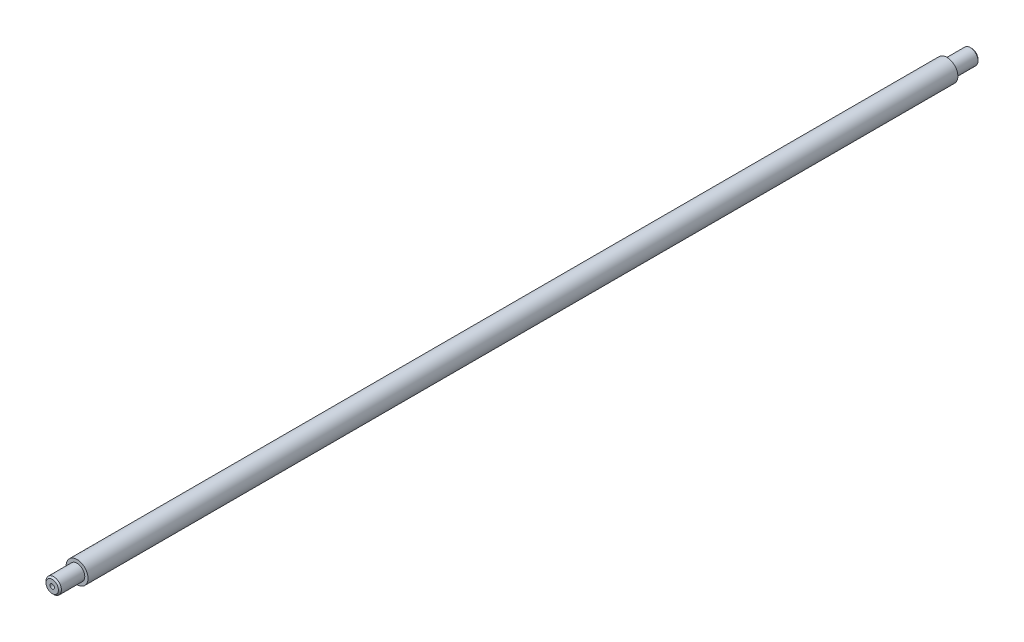
ISO-10303-21;
HEADER;
FILE_DESCRIPTION(('STEP AP214'),'2;1');
FILE_NAME('part.step','',(''),(''),'','','');
FILE_SCHEMA(('AUTOMOTIVE_DESIGN { 1 0 10303 214 1 1 1 1 }'));
ENDSEC;
DATA;
#1=APPLICATION_CONTEXT('core data for automotive mechanical design processes');
#2=APPLICATION_PROTOCOL_DEFINITION('international standard','automotive_design',2000,#1);
#3=PRODUCT_CONTEXT('',#1,'mechanical');
#4=PRODUCT('Part','Part','',(#3));
#5=PRODUCT_RELATED_PRODUCT_CATEGORY('part','',(#4));
#6=PRODUCT_DEFINITION_FORMATION('','',#4);
#7=PRODUCT_DEFINITION_CONTEXT('part definition',#1,'design');
#8=PRODUCT_DEFINITION('design','',#6,#7);
#9=PRODUCT_DEFINITION_SHAPE('','',#8);
#10=(LENGTH_UNIT() NAMED_UNIT(*) SI_UNIT(.MILLI.,.METRE.));
#11=(NAMED_UNIT(*) PLANE_ANGLE_UNIT() SI_UNIT($,.RADIAN.));
#12=(NAMED_UNIT(*) SI_UNIT($,.STERADIAN.) SOLID_ANGLE_UNIT());
#13=UNCERTAINTY_MEASURE_WITH_UNIT(LENGTH_MEASURE(1.E-05),#10,'distance_accuracy_value','');
#14=(GEOMETRIC_REPRESENTATION_CONTEXT(3) GLOBAL_UNCERTAINTY_ASSIGNED_CONTEXT((#13)) GLOBAL_UNIT_ASSIGNED_CONTEXT((#10,
#11,#12)) REPRESENTATION_CONTEXT('',''));
#15=CARTESIAN_POINT('',(0.,0.,0.));
#16=DIRECTION('',(0.,0.,1.));
#17=DIRECTION('',(1.,0.,0.));
#18=AXIS2_PLACEMENT_3D('',#15,#16,#17);
#19=CARTESIAN_POINT('',(0.,0.,222.25));
#20=DIRECTION('',(0.,0.,-1.));
#21=DIRECTION('',(-1.,0.,0.));
#22=AXIS2_PLACEMENT_3D('',#19,#20,#21);
#23=CYLINDRICAL_SURFACE('',#22,5.588);
#24=CARTESIAN_POINT('',(0.,0.,222.25));
#25=DIRECTION('',(0.,0.,1.));
#26=DIRECTION('',(1.,0.,0.));
#27=AXIS2_PLACEMENT_3D('',#24,#25,#26);
#28=CIRCLE('',#27,5.588);
#29=CARTESIAN_POINT('',(5.588,0.,222.25));
#30=VERTEX_POINT('',#29);
#31=EDGE_CURVE('E69',#30,#30,#28,.T.);
#32=ORIENTED_EDGE('',*,*,#31,.F.);
#33=EDGE_LOOP('',(#32));
#34=FACE_BOUND('',#33,.T.);
#35=CARTESIAN_POINT('',(0.,0.,-222.25));
#36=DIRECTION('',(0.,0.,1.));
#37=DIRECTION('',(1.,0.,0.));
#38=AXIS2_PLACEMENT_3D('',#35,#36,#37);
#39=CIRCLE('',#38,5.588);
#40=CARTESIAN_POINT('',(5.588,0.,-222.25));
#41=VERTEX_POINT('',#40);
#42=EDGE_CURVE('E65',#41,#41,#39,.T.);
#43=ORIENTED_EDGE('',*,*,#42,.T.);
#44=EDGE_LOOP('',(#43));
#45=FACE_BOUND('',#44,.T.);
#46=ADVANCED_FACE('F39',(#34,#45),#23,.T.);
#47=CARTESIAN_POINT('',(0.,0.,222.25));
#48=DIRECTION('',(0.,0.,1.));
#49=DIRECTION('',(1.,0.,0.));
#50=AXIS2_PLACEMENT_3D('',#47,#48,#49);
#51=PLANE('',#50);
#52=CARTESIAN_POINT('',(0.,0.,222.25));
#53=DIRECTION('',(0.,0.,1.));
#54=DIRECTION('',(1.,0.,0.));
#55=AXIS2_PLACEMENT_3D('',#52,#53,#54);
#56=CIRCLE('',#55,3.937);
#57=CARTESIAN_POINT('',(3.937,0.,222.25));
#58=VERTEX_POINT('',#57);
#59=EDGE_CURVE('E74',#58,#58,#56,.T.);
#60=ORIENTED_EDGE('',*,*,#59,.F.);
#61=EDGE_LOOP('',(#60));
#62=FACE_BOUND('',#61,.T.);
#63=ORIENTED_EDGE('',*,*,#31,.T.);
#64=EDGE_LOOP('',(#63));
#65=FACE_BOUND('',#64,.T.);
#66=ADVANCED_FACE('F122',(#62,#65),#51,.T.);
#67=CARTESIAN_POINT('',(0.,0.,-222.25));
#68=DIRECTION('',(0.,0.,1.));
#69=DIRECTION('',(1.,0.,0.));
#70=AXIS2_PLACEMENT_3D('',#67,#68,#69);
#71=PLANE('',#70);
#72=CARTESIAN_POINT('',(0.,0.,-222.25));
#73=DIRECTION('',(0.,0.,-1.));
#74=DIRECTION('',(-1.,0.,0.));
#75=AXIS2_PLACEMENT_3D('',#72,#73,#74);
#76=CIRCLE('',#75,3.937);
#77=CARTESIAN_POINT('',(-3.937,0.,-222.25));
#78=VERTEX_POINT('',#77);
#79=EDGE_CURVE('E64',#78,#78,#76,.T.);
#80=ORIENTED_EDGE('',*,*,#79,.F.);
#81=EDGE_LOOP('',(#80));
#82=FACE_BOUND('',#81,.T.);
#83=ORIENTED_EDGE('',*,*,#42,.F.);
#84=EDGE_LOOP('',(#83));
#85=FACE_BOUND('',#84,.T.);
#86=ADVANCED_FACE('F128',(#82,#85),#71,.F.);
#87=CARTESIAN_POINT('',(0.,0.,234.95));
#88=DIRECTION('',(0.,0.,-1.));
#89=DIRECTION('',(-1.,0.,0.));
#90=AXIS2_PLACEMENT_3D('',#87,#88,#89);
#91=CYLINDRICAL_SURFACE('',#90,3.937);
#92=CARTESIAN_POINT('',(0.,0.,234.188));
#93=DIRECTION('',(0.,0.,1.));
#94=DIRECTION('',(1.,0.,0.));
#95=AXIS2_PLACEMENT_3D('',#92,#93,#94);
#96=CIRCLE('',#95,3.937);
#97=CARTESIAN_POINT('',(3.937,0.,234.188));
#98=VERTEX_POINT('',#97);
#99=EDGE_CURVE('E10',#98,#98,#96,.F.);
#100=ORIENTED_EDGE('',*,*,#99,.T.);
#101=EDGE_LOOP('',(#100));
#102=FACE_BOUND('',#101,.T.);
#103=ORIENTED_EDGE('',*,*,#59,.T.);
#104=EDGE_LOOP('',(#103));
#105=FACE_BOUND('',#104,.T.);
#106=ADVANCED_FACE('F154',(#102,#105),#91,.T.);
#107=CARTESIAN_POINT('',(0.,0.,234.95));
#108=DIRECTION('',(0.,0.,1.));
#109=DIRECTION('',(1.,0.,0.));
#110=AXIS2_PLACEMENT_3D('',#107,#108,#109);
#111=PLANE('',#110);
#112=CARTESIAN_POINT('',(0.,0.,234.95));
#113=DIRECTION('',(0.,0.,1.));
#114=DIRECTION('',(1.,0.,0.));
#115=AXIS2_PLACEMENT_3D('',#112,#113,#114);
#116=CIRCLE('',#115,3.17499999999998);
#117=CARTESIAN_POINT('',(3.17499999999998,0.,234.95));
#118=VERTEX_POINT('',#117);
#119=EDGE_CURVE('E48',#118,#118,#116,.T.);
#120=ORIENTED_EDGE('',*,*,#119,.T.);
#121=EDGE_LOOP('',(#120));
#122=FACE_BOUND('',#121,.T.);
#123=CARTESIAN_POINT('',(0.,0.,234.95));
#124=DIRECTION('',(0.,0.,1.));
#125=DIRECTION('',(1.,0.,0.));
#126=AXIS2_PLACEMENT_3D('',#123,#124,#125);
#127=CIRCLE('',#126,1.143);
#128=CARTESIAN_POINT('',(1.143,0.,234.95));
#129=VERTEX_POINT('',#128);
#130=EDGE_CURVE('E81',#129,#129,#127,.T.);
#131=ORIENTED_EDGE('',*,*,#130,.F.);
#132=EDGE_LOOP('',(#131));
#133=FACE_BOUND('',#132,.T.);
#134=ADVANCED_FACE('F118',(#122,#133),#111,.T.);
#135=CARTESIAN_POINT('',(0.,0.,-234.95));
#136=DIRECTION('',(0.,0.,1.));
#137=DIRECTION('',(1.,0.,0.));
#138=AXIS2_PLACEMENT_3D('',#135,#136,#137);
#139=CYLINDRICAL_SURFACE('',#138,3.937);
#140=CARTESIAN_POINT('',(0.,0.,-234.188));
#141=DIRECTION('',(0.,0.,-1.));
#142=DIRECTION('',(-1.,0.,0.));
#143=AXIS2_PLACEMENT_3D('',#140,#141,#142);
#144=CIRCLE('',#143,3.937);
#145=CARTESIAN_POINT('',(-3.937,0.,-234.188));
#146=VERTEX_POINT('',#145);
#147=EDGE_CURVE('E53',#146,#146,#144,.F.);
#148=ORIENTED_EDGE('',*,*,#147,.T.);
#149=EDGE_LOOP('',(#148));
#150=FACE_BOUND('',#149,.T.);
#151=ORIENTED_EDGE('',*,*,#79,.T.);
#152=EDGE_LOOP('',(#151));
#153=FACE_BOUND('',#152,.T.);
#154=ADVANCED_FACE('F109',(#150,#153),#139,.T.);
#155=CARTESIAN_POINT('',(0.,0.,-234.95));
#156=DIRECTION('',(0.,0.,-1.));
#157=DIRECTION('',(-1.,0.,0.));
#158=AXIS2_PLACEMENT_3D('',#155,#156,#157);
#159=PLANE('',#158);
#160=CARTESIAN_POINT('',(0.,0.,-234.95));
#161=DIRECTION('',(0.,0.,-1.));
#162=DIRECTION('',(-1.,0.,0.));
#163=AXIS2_PLACEMENT_3D('',#160,#161,#162);
#164=CIRCLE('',#163,3.17499999999998);
#165=CARTESIAN_POINT('',(-3.17499999999998,0.,-234.95));
#166=VERTEX_POINT('',#165);
#167=EDGE_CURVE('E58',#166,#166,#164,.T.);
#168=ORIENTED_EDGE('',*,*,#167,.T.);
#169=EDGE_LOOP('',(#168));
#170=FACE_BOUND('',#169,.T.);
#171=CARTESIAN_POINT('',(0.,0.,-234.95));
#172=DIRECTION('',(0.,0.,-1.));
#173=DIRECTION('',(-1.,0.,0.));
#174=AXIS2_PLACEMENT_3D('',#171,#172,#173);
#175=CIRCLE('',#174,1.143);
#176=CARTESIAN_POINT('',(-1.143,0.,-234.95));
#177=VERTEX_POINT('',#176);
#178=EDGE_CURVE('E89',#177,#177,#175,.T.);
#179=ORIENTED_EDGE('',*,*,#178,.F.);
#180=EDGE_LOOP('',(#179));
#181=FACE_BOUND('',#180,.T.);
#182=ADVANCED_FACE('F106',(#170,#181),#159,.T.);
#183=CARTESIAN_POINT('',(0.,0.,209.55));
#184=DIRECTION('',(0.,0.,1.));
#185=DIRECTION('',(1.,0.,0.));
#186=AXIS2_PLACEMENT_3D('',#183,#184,#185);
#187=CYLINDRICAL_SURFACE('',#186,1.143);
#188=CARTESIAN_POINT('',(0.,0.,209.55));
#189=DIRECTION('',(0.,0.,1.));
#190=DIRECTION('',(1.,0.,0.));
#191=AXIS2_PLACEMENT_3D('',#188,#189,#190);
#192=CIRCLE('',#191,1.143);
#193=CARTESIAN_POINT('',(1.143,0.,209.55));
#194=VERTEX_POINT('',#193);
#195=EDGE_CURVE('E70',#194,#194,#192,.T.);
#196=ORIENTED_EDGE('',*,*,#195,.F.);
#197=EDGE_LOOP('',(#196));
#198=FACE_BOUND('',#197,.T.);
#199=ORIENTED_EDGE('',*,*,#130,.T.);
#200=EDGE_LOOP('',(#199));
#201=FACE_BOUND('',#200,.T.);
#202=ADVANCED_FACE('F108',(#198,#201),#187,.F.);
#203=CARTESIAN_POINT('',(0.,0.,209.55));
#204=DIRECTION('',(0.,0.,1.));
#205=DIRECTION('',(1.,0.,0.));
#206=AXIS2_PLACEMENT_3D('',#203,#204,#205);
#207=PLANE('',#206);
#208=ORIENTED_EDGE('',*,*,#195,.T.);
#209=EDGE_LOOP('',(#208));
#210=FACE_BOUND('',#209,.T.);
#211=ADVANCED_FACE('F102',(#210),#207,.T.);
#212=CARTESIAN_POINT('',(0.,0.,-209.55));
#213=DIRECTION('',(0.,0.,-1.));
#214=DIRECTION('',(-1.,0.,0.));
#215=AXIS2_PLACEMENT_3D('',#212,#213,#214);
#216=CYLINDRICAL_SURFACE('',#215,1.143);
#217=CARTESIAN_POINT('',(0.,0.,-209.55));
#218=DIRECTION('',(0.,0.,-1.));
#219=DIRECTION('',(-1.,0.,0.));
#220=AXIS2_PLACEMENT_3D('',#217,#218,#219);
#221=CIRCLE('',#220,1.143);
#222=CARTESIAN_POINT('',(-1.143,0.,-209.55));
#223=VERTEX_POINT('',#222);
#224=EDGE_CURVE('E85',#223,#223,#221,.T.);
#225=ORIENTED_EDGE('',*,*,#224,.F.);
#226=EDGE_LOOP('',(#225));
#227=FACE_BOUND('',#226,.T.);
#228=ORIENTED_EDGE('',*,*,#178,.T.);
#229=EDGE_LOOP('',(#228));
#230=FACE_BOUND('',#229,.T.);
#231=ADVANCED_FACE('F99',(#227,#230),#216,.F.);
#232=CARTESIAN_POINT('',(0.,0.,-209.55));
#233=DIRECTION('',(0.,0.,-1.));
#234=DIRECTION('',(-1.,0.,0.));
#235=AXIS2_PLACEMENT_3D('',#232,#233,#234);
#236=PLANE('',#235);
#237=ORIENTED_EDGE('',*,*,#224,.T.);
#238=EDGE_LOOP('',(#237));
#239=FACE_BOUND('',#238,.T.);
#240=ADVANCED_FACE('F97',(#239),#236,.T.);
#241=CARTESIAN_POINT('',(0.,0.,-234.95));
#242=DIRECTION('',(0.,0.,1.));
#243=DIRECTION('',(1.,0.,0.));
#244=AXIS2_PLACEMENT_3D('',#241,#242,#243);
#245=CONICAL_SURFACE('',#244,3.17499999999998,0.785398163397432);
#246=ORIENTED_EDGE('',*,*,#147,.F.);
#247=EDGE_LOOP('',(#246));
#248=FACE_BOUND('',#247,.T.);
#249=ORIENTED_EDGE('',*,*,#167,.F.);
#250=EDGE_LOOP('',(#249));
#251=FACE_BOUND('',#250,.T.);
#252=ADVANCED_FACE('F135',(#248,#251),#245,.T.);
#253=CARTESIAN_POINT('',(0.,0.,234.95));
#254=DIRECTION('',(0.,0.,-1.));
#255=DIRECTION('',(-1.,0.,0.));
#256=AXIS2_PLACEMENT_3D('',#253,#254,#255);
#257=CONICAL_SURFACE('',#256,3.17499999999998,0.785398163397432);
#258=ORIENTED_EDGE('',*,*,#99,.F.);
#259=EDGE_LOOP('',(#258));
#260=FACE_BOUND('',#259,.T.);
#261=ORIENTED_EDGE('',*,*,#119,.F.);
#262=EDGE_LOOP('',(#261));
#263=FACE_BOUND('',#262,.T.);
#264=ADVANCED_FACE('F42',(#260,#263),#257,.T.);
#265=CLOSED_SHELL('',(#46,#66,#86,#106,#134,#154,#182,#202,#211,#231,#240,#252,#264));
#266=MANIFOLD_SOLID_BREP('B2',#265);
#267=ADVANCED_BREP_SHAPE_REPRESENTATION('',(#18,#266),#14);
#268=SHAPE_DEFINITION_REPRESENTATION(#9,#267);
ENDSEC;
END-ISO-10303-21;
